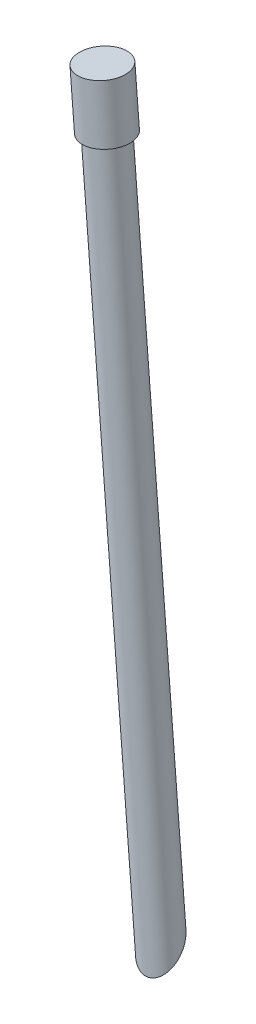
ISO-10303-21;
HEADER;
FILE_DESCRIPTION(('STEP AP214'),'2;1');
FILE_NAME('part.step','',(''),(''),'','','');
FILE_SCHEMA(('AUTOMOTIVE_DESIGN { 1 0 10303 214 1 1 1 1 }'));
ENDSEC;
DATA;
#1=APPLICATION_CONTEXT('core data for automotive mechanical design processes');
#2=APPLICATION_PROTOCOL_DEFINITION('international standard','automotive_design',2000,#1);
#3=PRODUCT_CONTEXT('',#1,'mechanical');
#4=PRODUCT('Part','Part','',(#3));
#5=PRODUCT_RELATED_PRODUCT_CATEGORY('part','',(#4));
#6=PRODUCT_DEFINITION_FORMATION('','',#4);
#7=PRODUCT_DEFINITION_CONTEXT('part definition',#1,'design');
#8=PRODUCT_DEFINITION('design','',#6,#7);
#9=PRODUCT_DEFINITION_SHAPE('','',#8);
#10=(LENGTH_UNIT() NAMED_UNIT(*) SI_UNIT(.MILLI.,.METRE.));
#11=(NAMED_UNIT(*) PLANE_ANGLE_UNIT() SI_UNIT($,.RADIAN.));
#12=(NAMED_UNIT(*) SI_UNIT($,.STERADIAN.) SOLID_ANGLE_UNIT());
#13=UNCERTAINTY_MEASURE_WITH_UNIT(LENGTH_MEASURE(1.E-05),#10,'distance_accuracy_value','');
#14=(GEOMETRIC_REPRESENTATION_CONTEXT(3) GLOBAL_UNCERTAINTY_ASSIGNED_CONTEXT((#13)) GLOBAL_UNIT_ASSIGNED_CONTEXT((#10,
#11,#12)) REPRESENTATION_CONTEXT('',''));
#15=CARTESIAN_POINT('',(0.,0.,0.));
#16=DIRECTION('',(0.,0.,1.));
#17=DIRECTION('',(1.,0.,0.));
#18=AXIS2_PLACEMENT_3D('',#15,#16,#17);
#19=CARTESIAN_POINT('',(3.05023369920446,255.390679145159,0.));
#20=DIRECTION('',(0.0794029549851619,-0.99684260078491,0.));
#21=DIRECTION('',(0.99684260078491,0.0794029549851619,0.));
#22=AXIS2_PLACEMENT_3D('',#19,#20,#21);
#23=PLANE('',#22);
#24=CARTESIAN_POINT('',(3.05023369920459,255.390679145159,0.));
#25=DIRECTION('',(-0.0794029549851619,0.99684260078491,0.));
#26=DIRECTION('',(-0.99684260078491,-0.0794029549851619,0.));
#27=AXIS2_PLACEMENT_3D('',#24,#25,#26);
#28=CIRCLE('',#27,1.98743013570403);
#29=CARTESIAN_POINT('',(1.06907867385108,255.232871319557,0.));
#30=VERTEX_POINT('',#29);
#31=EDGE_CURVE('E10',#30,#30,#28,.T.);
#32=ORIENTED_EDGE('',*,*,#31,.T.);
#33=EDGE_LOOP('',(#32));
#34=FACE_BOUND('',#33,.T.);
#35=ADVANCED_FACE('F34',(#34),#23,.F.);
#36=CARTESIAN_POINT('',(2.31501393944986,264.620793787609,0.));
#37=DIRECTION('',(-0.0794029549851619,0.99684260078491,0.));
#38=DIRECTION('',(-0.99684260078491,-0.0794029549851619,0.));
#39=AXIS2_PLACEMENT_3D('',#36,#37,#38);
#40=CYLINDRICAL_SURFACE('',#39,1.98743013570403);
#41=ORIENTED_EDGE('',*,*,#31,.F.);
#42=EDGE_LOOP('',(#41));
#43=FACE_BOUND('',#42,.T.);
#44=CARTESIAN_POINT('',(3.44415760665564,250.445269588446,0.));
#45=DIRECTION('',(-0.0794029549851619,0.99684260078491,0.));
#46=DIRECTION('',(-0.99684260078491,-0.0794029549851619,0.));
#47=AXIS2_PLACEMENT_3D('',#44,#45,#46);
#48=CIRCLE('',#47,1.98743013570403);
#49=CARTESIAN_POINT('',(1.46300258130212,250.287461762845,0.));
#50=VERTEX_POINT('',#49);
#51=EDGE_CURVE('E45',#50,#50,#48,.T.);
#52=ORIENTED_EDGE('',*,*,#51,.T.);
#53=EDGE_LOOP('',(#52));
#54=FACE_BOUND('',#53,.T.);
#55=ADVANCED_FACE('F69',(#43,#54),#40,.T.);
#56=CARTESIAN_POINT('',(3.44164075013408,250.476866772722,0.));
#57=DIRECTION('',(0.0794029549851619,-0.99684260078491,0.));
#58=DIRECTION('',(0.99684260078491,0.0794029549851619,0.));
#59=AXIS2_PLACEMENT_3D('',#56,#57,#58);
#60=CONICAL_SURFACE('',#59,1.58949552127778,1.49130969717983);
#61=ORIENTED_EDGE('',*,*,#51,.F.);
#62=EDGE_LOOP('',(#61));
#63=FACE_BOUND('',#62,.T.);
#64=CARTESIAN_POINT('',(3.44164075013408,250.476866772722,0.));
#65=DIRECTION('',(-0.0794029549851619,0.99684260078491,0.));
#66=DIRECTION('',(-0.99684260078491,-0.0794029549851619,0.));
#67=AXIS2_PLACEMENT_3D('',#64,#65,#66);
#68=CIRCLE('',#67,1.58949552127778);
#69=CARTESIAN_POINT('',(1.85716390076757,250.350656131397,0.));
#70=VERTEX_POINT('',#69);
#71=EDGE_CURVE('E49',#70,#70,#68,.T.);
#72=ORIENTED_EDGE('',*,*,#71,.T.);
#73=EDGE_LOOP('',(#72));
#74=FACE_BOUND('',#73,.T.);
#75=ADVANCED_FACE('F66',(#63,#74),#60,.F.);
#76=CARTESIAN_POINT('',(2.31501393944986,264.620793787609,0.));
#77=DIRECTION('',(-0.0794029549851619,0.99684260078491,0.));
#78=DIRECTION('',(-0.99684260078491,-0.0794029549851619,0.));
#79=AXIS2_PLACEMENT_3D('',#76,#77,#78);
#80=CYLINDRICAL_SURFACE('',#79,1.58949552127778);
#81=CARTESIAN_POINT('',(7.16138326464008,191.102115070779,1.23019814032699));
#82=CARTESIAN_POINT('',(7.23229552579355,191.03919469572,1.28394998137421));
#83=CARTESIAN_POINT('',(7.30879884732793,190.979043130474,1.33368319858708));
#84=CARTESIAN_POINT('',(7.47297255003005,190.866761393197,1.42258641591768));
#85=CARTESIAN_POINT('',(7.5606187028706,190.81461434405,1.46177877597085));
#86=CARTESIAN_POINT('',(7.72101224154953,190.734376063486,1.51751698941154));
#87=CARTESIAN_POINT('',(7.79127650812043,190.703606526419,1.53732505144587));
#88=CARTESIAN_POINT('',(7.93655812797751,190.649731730499,1.56808757066889));
#89=CARTESIAN_POINT('',(8.01156973619942,190.626617411096,1.57905251660626));
#90=CARTESIAN_POINT('',(8.15264723096088,190.592763548643,1.58966593970083));
#91=CARTESIAN_POINT('',(8.21826516035333,190.580649696362,1.59082269721615));
#92=CARTESIAN_POINT('',(8.35012415239133,190.564137890616,1.58502459350744));
#93=CARTESIAN_POINT('',(8.41636479302528,190.559735043931,1.57807488112445));
#94=CARTESIAN_POINT('',(8.54770861513043,190.559217750557,1.55579165159899));
#95=CARTESIAN_POINT('',(8.61280713378697,190.563131690853,1.5404295539948));
#96=CARTESIAN_POINT('',(8.73951334554394,190.579243488446,1.50173714973292));
#97=CARTESIAN_POINT('',(8.80112070086593,190.591442145833,1.47840607358687));
#98=CARTESIAN_POINT('',(8.91601267712403,190.622563980173,1.42621825729255));
#99=CARTESIAN_POINT('',(8.96956368828961,190.641103683259,1.39771274851557));
#100=CARTESIAN_POINT('',(9.07105290094204,190.684014291288,1.3356133518217));
#101=CARTESIAN_POINT('',(9.11898885598184,190.708387518294,1.30201743960326));
#102=CARTESIAN_POINT('',(9.22645274941763,190.77242833922,1.21690737180328));
#103=CARTESIAN_POINT('',(9.28316531740472,190.814347005303,1.16352960890253));
#104=CARTESIAN_POINT('',(9.38499653607012,190.904917519671,1.05167260009606));
#105=CARTESIAN_POINT('',(9.4300911016222,190.953583038786,0.993183087750098));
#106=CARTESIAN_POINT('',(9.52435306980997,191.07491821467,0.850317197201138));
#107=CARTESIAN_POINT('',(9.56861465130559,191.149707033101,0.764514058302374));
#108=CARTESIAN_POINT('',(9.63865666143367,191.304539793642,0.590241879461885));
#109=CARTESIAN_POINT('',(9.66440728756516,191.38459198463,0.501768778413107));
#110=CARTESIAN_POINT('',(9.70515228396298,191.574666982696,0.294729737330918));
#111=CARTESIAN_POINT('',(9.71373215930118,191.685812130668,0.175930062550231));
#112=CARTESIAN_POINT('',(9.70459185055877,191.909420535555,-0.0593472994526023));
#113=CARTESIAN_POINT('',(9.68684561680292,192.021884988638,-0.175822571062681));
#114=CARTESIAN_POINT('',(9.62623735722751,192.246837198417,-0.405323386435331));
#115=CARTESIAN_POINT('',(9.58303046439035,192.359303652209,-0.518278695682898));
#116=CARTESIAN_POINT('',(9.47169077202967,192.579765016741,-0.73597194282751));
#117=CARTESIAN_POINT('',(9.40357913619403,192.687763637697,-0.840716766367695));
#118=CARTESIAN_POINT('',(9.25997558180356,192.872631852178,-1.01608377955568));
#119=CARTESIAN_POINT('',(9.18947391031394,192.951091715441,-1.08912059101975));
#120=CARTESIAN_POINT('',(9.03271211336089,193.100774270069,-1.2250796996719));
#121=CARTESIAN_POINT('',(8.94647547763594,193.172007506205,-1.288016814296));
#122=CARTESIAN_POINT('',(8.78292628080113,193.286497273421,-1.38522562850872));
#123=CARTESIAN_POINT('',(8.70921858882906,193.332187926892,-1.42268461237164));
#124=CARTESIAN_POINT('',(8.55355160531122,193.415850693723,-1.48790944238165));
#125=CARTESIAN_POINT('',(8.47160410458322,193.453833607932,-1.51568889217466));
#126=CARTESIAN_POINT('',(8.31814579056628,193.512948855445,-1.55462642987395));
#127=CARTESIAN_POINT('',(8.24792544654084,193.535938546444,-1.56802131972199));
#128=CARTESIAN_POINT('',(8.10425705298336,193.574149165316,-1.58576976128242));
#129=CARTESIAN_POINT('',(8.03081092103388,193.589374642547,-1.59012861216472));
#130=CARTESIAN_POINT('',(7.88208515069246,193.610875706757,-1.58870878152959));
#131=CARTESIAN_POINT('',(7.80679587991185,193.617083156894,-1.58285364966403));
#132=CARTESIAN_POINT('',(7.65767492882799,193.619506715707,-1.56039242021951));
#133=CARTESIAN_POINT('',(7.58384233089137,193.615729330888,-1.54379332914154));
#134=CARTESIAN_POINT('',(7.44930109011969,193.599321623756,-1.50305938814872));
#135=CARTESIAN_POINT('',(7.38809172292816,193.587830514692,-1.4800944384268));
#136=CARTESIAN_POINT('',(7.27061033931721,193.557799740933,-1.42724578861329));
#137=CARTESIAN_POINT('',(7.21433865801083,193.539259598287,-1.39736161942512));
#138=CARTESIAN_POINT('',(7.1070234936347,193.495736328952,-1.33140862315557));
#139=CARTESIAN_POINT('',(7.05607150075654,193.470660383624,-1.29525343990504));
#140=CARTESIAN_POINT('',(6.96089771373851,193.415308458457,-1.21840317001645));
#141=CARTESIAN_POINT('',(6.91667931064619,193.385029874787,-1.17770581369214));
#142=CARTESIAN_POINT('',(6.81552604387084,193.304812749865,-1.07265834578818));
#143=CARTESIAN_POINT('',(6.76262419067689,193.252397523921,-1.0063051871757));
#144=CARTESIAN_POINT('',(6.67098093836434,193.141238668374,-0.869243552775393));
#145=CARTESIAN_POINT('',(6.63227202149298,193.08248091572,-0.798525513913773));
#146=CARTESIAN_POINT('',(6.55627298254859,192.938728576321,-0.628945258745028));
#147=CARTESIAN_POINT('',(6.52453817524203,192.851919059728,-0.529137904781321));
#148=CARTESIAN_POINT('',(6.48240324519275,192.674012417613,-0.32897873369321));
#149=CARTESIAN_POINT('',(6.47202814227083,192.582910391598,-0.228626415958337));
#150=CARTESIAN_POINT('',(6.47022045341109,192.375301713388,-0.00426829254035981));
#151=CARTESIAN_POINT('',(6.48428080964012,192.25823034852,0.119257397804577));
#152=CARTESIAN_POINT('',(6.53985018598438,192.024279026188,0.360510953826005));
#153=CARTESIAN_POINT('',(6.58140381048129,191.907399689684,0.478229063384259));
#154=CARTESIAN_POINT('',(6.66503919303544,191.731267352243,0.651341202822836));
#155=CARTESIAN_POINT('',(6.69773408386407,191.670695173723,0.710073055496886));
#156=CARTESIAN_POINT('',(6.7705133234503,191.551020224341,0.824461323252689));
#157=CARTESIAN_POINT('',(6.81059973807343,191.491917869535,0.880116872868537));
#158=CARTESIAN_POINT('',(6.89810901934113,191.375938418544,0.987575403331041));
#159=CARTESIAN_POINT('',(6.94551710025396,191.31905712086,1.03938584368184));
#160=CARTESIAN_POINT('',(7.04780433952546,191.208191126775,1.13844603706649));
#161=CARTESIAN_POINT('',(7.10267788211459,191.154204295215,1.18569917302856));
#162=CARTESIAN_POINT('',(7.16138326464008,191.102115070779,1.23019814032699));
#163=B_SPLINE_CURVE_WITH_KNOTS('',3,(#81,#82,#83,#84,#85,#86,#87,#88,#89,#90,#91,#92,#93,#94,
#95,#96,#97,#98,#99,#100,#101,#102,#103,#104,#105,#106,#107,#108,#109,#110,#111,#112,#113,#114,
#115,#116,#117,#118,#119,#120,#121,#122,#123,#124,#125,#126,#127,#128,#129,#130,#131,#132,#133,
#134,#135,#136,#137,#138,#139,#140,#141,#142,#143,#144,#145,#146,#147,#148,#149,#150,#151,#152,
#153,#154,#155,#156,#157,#158,#159,#160,#161,#162),.UNSPECIFIED.,.T.,.F.,(4,2,2,2,2,2,2,2,2,2,2,
2,2,2,2,2,2,2,2,2,2,2,2,2,2,2,2,2,2,2,2,2,2,2,2,2,2,2,2,2,4),(0.,0.326725893297966,
0.652753148465093,0.889594166403929,1.12615385427017,1.32551747678992,1.52475454201378,
1.72467273835261,1.92461024434785,2.11413065020916,2.30372662145082,2.56759602396711,
2.83200812716359,3.19638616307309,3.56134953897174,4.04754731735734,4.53422650927161,
5.02765445817448,5.52066407000826,5.9042909486137,6.28734975191299,6.56980088713991,
6.85185344827112,7.0762542941817,7.30052350332036,7.52647854891641,7.75228638980673,
7.95047794211194,8.14868293498146,8.3498726346911,8.55116332117704,8.84872732943975,
9.14696815973914,9.55285915306384,9.95922531940657,10.4690129095142,10.9796296007987,
11.250780043849,11.5220063862379,11.7926919951506,12.0631750996948),.UNSPECIFIED.);
#164=CARTESIAN_POINT('',(7.16138326464008,191.102115070779,1.23019814032699));
#165=VERTEX_POINT('',#164);
#166=EDGE_CURVE('E37',#165,#165,#163,.T.);
#167=ORIENTED_EDGE('',*,*,#166,.T.);
#168=EDGE_LOOP('',(#167));
#169=FACE_BOUND('',#168,.T.);
#170=ORIENTED_EDGE('',*,*,#71,.F.);
#171=EDGE_LOOP('',(#170));
#172=FACE_BOUND('',#171,.T.);
#173=ADVANCED_FACE('F58',(#169,#172),#80,.T.);
#174=CARTESIAN_POINT('',(0.,141.580277667396,-47.2909422819565));
#175=DIRECTION('',(0.,1.,0.));
#176=DIRECTION('',(0.,0.,-1.));
#177=AXIS2_PLACEMENT_3D('',#174,#175,#176);
#178=SPHERICAL_SURFACE('',#177,69.6993461802126);
#179=ORIENTED_EDGE('',*,*,#166,.F.);
#180=EDGE_LOOP('',(#179));
#181=FACE_BOUND('',#180,.T.);
#182=ADVANCED_FACE('F61',(#181),#178,.F.);
#183=CLOSED_SHELL('',(#35,#55,#75,#173,#182));
#184=MANIFOLD_SOLID_BREP('B2',#183);
#185=ADVANCED_BREP_SHAPE_REPRESENTATION('',(#18,#184),#14);
#186=SHAPE_DEFINITION_REPRESENTATION(#9,#185);
ENDSEC;
END-ISO-10303-21;
